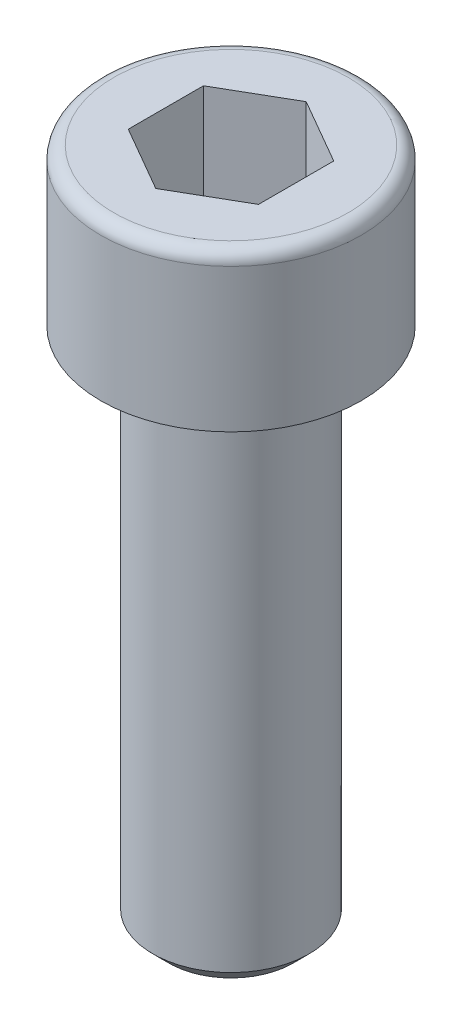
ISO-10303-21;
HEADER;
FILE_DESCRIPTION(('STEP AP214'),'2;1');
FILE_NAME('part.step','',(''),(''),'','','');
FILE_SCHEMA(('AUTOMOTIVE_DESIGN { 1 0 10303 214 1 1 1 1 }'));
ENDSEC;
DATA;
#1=APPLICATION_CONTEXT('core data for automotive mechanical design processes');
#2=APPLICATION_PROTOCOL_DEFINITION('international standard','automotive_design',2000,#1);
#3=PRODUCT_CONTEXT('',#1,'mechanical');
#4=PRODUCT('Part','Part','',(#3));
#5=PRODUCT_RELATED_PRODUCT_CATEGORY('part','',(#4));
#6=PRODUCT_DEFINITION_FORMATION('','',#4);
#7=PRODUCT_DEFINITION_CONTEXT('part definition',#1,'design');
#8=PRODUCT_DEFINITION('design','',#6,#7);
#9=PRODUCT_DEFINITION_SHAPE('','',#8);
#10=(LENGTH_UNIT() NAMED_UNIT(*) SI_UNIT(.MILLI.,.METRE.));
#11=(NAMED_UNIT(*) PLANE_ANGLE_UNIT() SI_UNIT($,.RADIAN.));
#12=(NAMED_UNIT(*) SI_UNIT($,.STERADIAN.) SOLID_ANGLE_UNIT());
#13=UNCERTAINTY_MEASURE_WITH_UNIT(LENGTH_MEASURE(1.E-05),#10,'distance_accuracy_value','');
#14=(GEOMETRIC_REPRESENTATION_CONTEXT(3) GLOBAL_UNCERTAINTY_ASSIGNED_CONTEXT((#13)) GLOBAL_UNIT_ASSIGNED_CONTEXT((#10,
#11,#12)) REPRESENTATION_CONTEXT('',''));
#15=CARTESIAN_POINT('',(0.,0.,0.));
#16=DIRECTION('',(0.,0.,1.));
#17=DIRECTION('',(1.,0.,0.));
#18=AXIS2_PLACEMENT_3D('',#15,#16,#17);
#19=CARTESIAN_POINT('',(0.,6.,0.));
#20=DIRECTION('',(0.,-1.,0.));
#21=DIRECTION('',(0.,0.,-1.));
#22=AXIS2_PLACEMENT_3D('',#19,#20,#21);
#23=PLANE('',#22);
#24=DIRECTION('',(0.866025403784448,0.,0.499999999999983));
#25=VECTOR('',#24,1.);
#26=CARTESIAN_POINT('',(-2.5,6.,1.4433756729741));
#27=LINE('',#26,#25);
#28=CARTESIAN_POINT('',(-2.5,6.,1.4433756729741));
#29=VERTEX_POINT('',#28);
#30=CARTESIAN_POINT('',(0.,6.,2.8867513459481));
#31=VERTEX_POINT('',#30);
#32=EDGE_CURVE('E73',#29,#31,#27,.T.);
#33=ORIENTED_EDGE('',*,*,#32,.F.);
#34=DIRECTION('',(0.,0.,1.));
#35=VECTOR('',#34,1.);
#36=CARTESIAN_POINT('',(-2.5,6.,-1.4433756729741));
#37=LINE('',#36,#35);
#38=CARTESIAN_POINT('',(-2.5,6.,-1.4433756729741));
#39=VERTEX_POINT('',#38);
#40=EDGE_CURVE('E86',#39,#29,#37,.T.);
#41=ORIENTED_EDGE('',*,*,#40,.F.);
#42=DIRECTION('',(-0.866025403784448,0.,0.499999999999983));
#43=VECTOR('',#42,1.);
#44=CARTESIAN_POINT('',(0.,6.,-2.8867513459481));
#45=LINE('',#44,#43);
#46=CARTESIAN_POINT('',(0.,6.,-2.8867513459481));
#47=VERTEX_POINT('',#46);
#48=EDGE_CURVE('E95',#47,#39,#45,.T.);
#49=ORIENTED_EDGE('',*,*,#48,.F.);
#50=DIRECTION('',(-0.866025403784448,0.,-0.499999999999983));
#51=VECTOR('',#50,1.);
#52=CARTESIAN_POINT('',(2.5,6.,-1.4433756729741));
#53=LINE('',#52,#51);
#54=CARTESIAN_POINT('',(2.5,6.,-1.4433756729741));
#55=VERTEX_POINT('',#54);
#56=EDGE_CURVE('E97',#55,#47,#53,.T.);
#57=ORIENTED_EDGE('',*,*,#56,.F.);
#58=DIRECTION('',(0.,0.,-1.));
#59=VECTOR('',#58,1.);
#60=CARTESIAN_POINT('',(2.5,6.,1.4433756729741));
#61=LINE('',#60,#59);
#62=CARTESIAN_POINT('',(2.5,6.,1.4433756729741));
#63=VERTEX_POINT('',#62);
#64=EDGE_CURVE('E108',#63,#55,#61,.T.);
#65=ORIENTED_EDGE('',*,*,#64,.F.);
#66=DIRECTION('',(0.866025403784448,0.,-0.499999999999983));
#67=VECTOR('',#66,1.);
#68=CARTESIAN_POINT('',(0.,6.,2.8867513459481));
#69=LINE('',#68,#67);
#70=EDGE_CURVE('E89',#31,#63,#69,.T.);
#71=ORIENTED_EDGE('',*,*,#70,.F.);
#72=EDGE_LOOP('',(#33,#41,#49,#57,#65,#71));
#73=FACE_BOUND('',#72,.T.);
#74=CARTESIAN_POINT('',(0.,6.,0.));
#75=DIRECTION('',(0.,-1.,0.));
#76=DIRECTION('',(0.,0.,-1.));
#77=AXIS2_PLACEMENT_3D('',#74,#75,#76);
#78=CIRCLE('',#77,4.49999997313664);
#79=CARTESIAN_POINT('',(0.,6.,-4.49999997313664));
#80=VERTEX_POINT('',#79);
#81=EDGE_CURVE('E116',#80,#80,#78,.T.);
#82=ORIENTED_EDGE('',*,*,#81,.F.);
#83=EDGE_LOOP('',(#82));
#84=FACE_BOUND('',#83,.T.);
#85=ADVANCED_FACE('F17',(#73,#84),#23,.F.);
#86=CARTESIAN_POINT('',(0.,5.50000000000009,0.));
#87=DIRECTION('',(0.,-1.,0.));
#88=DIRECTION('',(0.,0.,-1.));
#89=AXIS2_PLACEMENT_3D('',#86,#87,#88);
#90=TOROIDAL_SURFACE('',#89,4.50000000000009,0.499999999999911);
#91=ORIENTED_EDGE('',*,*,#81,.T.);
#92=EDGE_LOOP('',(#91));
#93=FACE_BOUND('',#92,.T.);
#94=CARTESIAN_POINT('',(0.,5.5,0.));
#95=DIRECTION('',(0.,-1.,0.));
#96=DIRECTION('',(0.,0.,-1.));
#97=AXIS2_PLACEMENT_3D('',#94,#95,#96);
#98=CIRCLE('',#97,5.);
#99=CARTESIAN_POINT('',(0.,5.5,-5.));
#100=VERTEX_POINT('',#99);
#101=EDGE_CURVE('E121',#100,#100,#98,.T.);
#102=ORIENTED_EDGE('',*,*,#101,.F.);
#103=EDGE_LOOP('',(#102));
#104=FACE_BOUND('',#103,.T.);
#105=ADVANCED_FACE('F190',(#93,#104),#90,.T.);
#106=CARTESIAN_POINT('',(0.,0.,0.));
#107=DIRECTION('',(0.,-1.,0.));
#108=DIRECTION('',(0.,0.,-1.));
#109=AXIS2_PLACEMENT_3D('',#106,#107,#108);
#110=CYLINDRICAL_SURFACE('',#109,5.);
#111=CARTESIAN_POINT('',(0.,0.,0.));
#112=DIRECTION('',(0.,-1.,0.));
#113=DIRECTION('',(0.,0.,-1.));
#114=AXIS2_PLACEMENT_3D('',#111,#112,#113);
#115=CIRCLE('',#114,5.);
#116=CARTESIAN_POINT('',(0.,0.,-5.));
#117=VERTEX_POINT('',#116);
#118=EDGE_CURVE('E124',#117,#117,#115,.T.);
#119=ORIENTED_EDGE('',*,*,#118,.F.);
#120=EDGE_LOOP('',(#119));
#121=FACE_BOUND('',#120,.T.);
#122=ORIENTED_EDGE('',*,*,#101,.T.);
#123=EDGE_LOOP('',(#122));
#124=FACE_BOUND('',#123,.T.);
#125=ADVANCED_FACE('F184',(#121,#124),#110,.T.);
#126=CARTESIAN_POINT('',(5.,0.,0.));
#127=DIRECTION('',(0.,1.,0.));
#128=DIRECTION('',(0.,0.,1.));
#129=AXIS2_PLACEMENT_3D('',#126,#127,#128);
#130=PLANE('',#129);
#131=CARTESIAN_POINT('',(0.,0.,0.));
#132=DIRECTION('',(0.,-1.,0.));
#133=DIRECTION('',(0.,0.,-1.));
#134=AXIS2_PLACEMENT_3D('',#131,#132,#133);
#135=CIRCLE('',#134,3.);
#136=CARTESIAN_POINT('',(0.,0.,-3.));
#137=VERTEX_POINT('',#136);
#138=EDGE_CURVE('E79',#137,#137,#135,.T.);
#139=ORIENTED_EDGE('',*,*,#138,.F.);
#140=EDGE_LOOP('',(#139));
#141=FACE_BOUND('',#140,.T.);
#142=ORIENTED_EDGE('',*,*,#118,.T.);
#143=EDGE_LOOP('',(#142));
#144=FACE_BOUND('',#143,.T.);
#145=ADVANCED_FACE('F181',(#141,#144),#130,.F.);
#146=CARTESIAN_POINT('',(-2.5,0.28,-1.4433756729741));
#147=DIRECTION('',(-1.,0.,0.));
#148=DIRECTION('',(0.,0.,1.));
#149=AXIS2_PLACEMENT_3D('',#146,#147,#148);
#150=PLANE('',#149);
#151=ORIENTED_EDGE('',*,*,#40,.T.);
#152=DIRECTION('',(0.,1.,0.));
#153=VECTOR('',#152,1.);
#154=CARTESIAN_POINT('',(-2.5,0.28,1.4433756729741));
#155=LINE('',#154,#153);
#156=CARTESIAN_POINT('',(-2.5,0.28,1.4433756729741));
#157=VERTEX_POINT('',#156);
#158=EDGE_CURVE('E69',#157,#29,#155,.T.);
#159=ORIENTED_EDGE('',*,*,#158,.F.);
#160=DIRECTION('',(0.,0.,1.));
#161=VECTOR('',#160,1.);
#162=CARTESIAN_POINT('',(-2.5,0.28,-1.4433756729741));
#163=LINE('',#162,#161);
#164=CARTESIAN_POINT('',(-2.5,0.28,-1.4433756729741));
#165=VERTEX_POINT('',#164);
#166=EDGE_CURVE('E78',#165,#157,#163,.T.);
#167=ORIENTED_EDGE('',*,*,#166,.F.);
#168=DIRECTION('',(0.,1.,0.));
#169=VECTOR('',#168,1.);
#170=CARTESIAN_POINT('',(-2.5,0.28,-1.4433756729741));
#171=LINE('',#170,#169);
#172=EDGE_CURVE('E94',#165,#39,#171,.T.);
#173=ORIENTED_EDGE('',*,*,#172,.T.);
#174=EDGE_LOOP('',(#151,#159,#167,#173));
#175=FACE_BOUND('',#174,.T.);
#176=ADVANCED_FACE('F92',(#175),#150,.F.);
#177=CARTESIAN_POINT('',(-2.5,0.28,1.4433756729741));
#178=DIRECTION('',(-0.499999999999983,0.,0.866025403784448));
#179=DIRECTION('',(0.866025403784448,0.,0.499999999999983));
#180=AXIS2_PLACEMENT_3D('',#177,#178,#179);
#181=PLANE('',#180);
#182=ORIENTED_EDGE('',*,*,#32,.T.);
#183=DIRECTION('',(0.,1.,0.));
#184=VECTOR('',#183,1.);
#185=CARTESIAN_POINT('',(0.,0.28,2.8867513459481));
#186=LINE('',#185,#184);
#187=CARTESIAN_POINT('',(0.,0.28,2.8867513459481));
#188=VERTEX_POINT('',#187);
#189=EDGE_CURVE('E135',#188,#31,#186,.T.);
#190=ORIENTED_EDGE('',*,*,#189,.F.);
#191=DIRECTION('',(0.866025403784448,0.,0.499999999999983));
#192=VECTOR('',#191,1.);
#193=CARTESIAN_POINT('',(-2.5,0.28,1.4433756729741));
#194=LINE('',#193,#192);
#195=EDGE_CURVE('E74',#157,#188,#194,.T.);
#196=ORIENTED_EDGE('',*,*,#195,.F.);
#197=ORIENTED_EDGE('',*,*,#158,.T.);
#198=EDGE_LOOP('',(#182,#190,#196,#197));
#199=FACE_BOUND('',#198,.T.);
#200=ADVANCED_FACE('F71',(#199),#181,.F.);
#201=CARTESIAN_POINT('',(0.,0.28,2.8867513459481));
#202=DIRECTION('',(0.499999999999983,0.,0.866025403784448));
#203=DIRECTION('',(0.866025403784448,0.,-0.499999999999983));
#204=AXIS2_PLACEMENT_3D('',#201,#202,#203);
#205=PLANE('',#204);
#206=ORIENTED_EDGE('',*,*,#70,.T.);
#207=DIRECTION('',(0.,1.,0.));
#208=VECTOR('',#207,1.);
#209=CARTESIAN_POINT('',(2.5,0.28,1.4433756729741));
#210=LINE('',#209,#208);
#211=CARTESIAN_POINT('',(2.5,0.28,1.4433756729741));
#212=VERTEX_POINT('',#211);
#213=EDGE_CURVE('E142',#212,#63,#210,.T.);
#214=ORIENTED_EDGE('',*,*,#213,.F.);
#215=DIRECTION('',(0.866025403784448,0.,-0.499999999999983));
#216=VECTOR('',#215,1.);
#217=CARTESIAN_POINT('',(0.,0.28,2.8867513459481));
#218=LINE('',#217,#216);
#219=EDGE_CURVE('E146',#188,#212,#218,.T.);
#220=ORIENTED_EDGE('',*,*,#219,.F.);
#221=ORIENTED_EDGE('',*,*,#189,.T.);
#222=EDGE_LOOP('',(#206,#214,#220,#221));
#223=FACE_BOUND('',#222,.T.);
#224=ADVANCED_FACE('F207',(#223),#205,.F.);
#225=CARTESIAN_POINT('',(2.5,0.28,1.4433756729741));
#226=DIRECTION('',(1.,0.,0.));
#227=DIRECTION('',(0.,0.,-1.));
#228=AXIS2_PLACEMENT_3D('',#225,#226,#227);
#229=PLANE('',#228);
#230=ORIENTED_EDGE('',*,*,#64,.T.);
#231=DIRECTION('',(0.,1.,0.));
#232=VECTOR('',#231,1.);
#233=CARTESIAN_POINT('',(2.5,0.28,-1.4433756729741));
#234=LINE('',#233,#232);
#235=CARTESIAN_POINT('',(2.5,0.28,-1.4433756729741));
#236=VERTEX_POINT('',#235);
#237=EDGE_CURVE('E150',#236,#55,#234,.T.);
#238=ORIENTED_EDGE('',*,*,#237,.F.);
#239=DIRECTION('',(0.,0.,-1.));
#240=VECTOR('',#239,1.);
#241=CARTESIAN_POINT('',(2.5,0.28,1.4433756729741));
#242=LINE('',#241,#240);
#243=EDGE_CURVE('E37',#212,#236,#242,.T.);
#244=ORIENTED_EDGE('',*,*,#243,.F.);
#245=ORIENTED_EDGE('',*,*,#213,.T.);
#246=EDGE_LOOP('',(#230,#238,#244,#245));
#247=FACE_BOUND('',#246,.T.);
#248=ADVANCED_FACE('F210',(#247),#229,.F.);
#249=CARTESIAN_POINT('',(2.5,0.28,-1.4433756729741));
#250=DIRECTION('',(0.499999999999983,0.,-0.866025403784448));
#251=DIRECTION('',(-0.866025403784448,0.,-0.499999999999983));
#252=AXIS2_PLACEMENT_3D('',#249,#250,#251);
#253=PLANE('',#252);
#254=ORIENTED_EDGE('',*,*,#56,.T.);
#255=DIRECTION('',(0.,1.,0.));
#256=VECTOR('',#255,1.);
#257=CARTESIAN_POINT('',(0.,0.28,-2.8867513459481));
#258=LINE('',#257,#256);
#259=CARTESIAN_POINT('',(0.,0.28,-2.8867513459481));
#260=VERTEX_POINT('',#259);
#261=EDGE_CURVE('E157',#260,#47,#258,.T.);
#262=ORIENTED_EDGE('',*,*,#261,.F.);
#263=DIRECTION('',(-0.866025403784448,0.,-0.499999999999983));
#264=VECTOR('',#263,1.);
#265=CARTESIAN_POINT('',(2.5,0.28,-1.4433756729741));
#266=LINE('',#265,#264);
#267=EDGE_CURVE('E32',#236,#260,#266,.T.);
#268=ORIENTED_EDGE('',*,*,#267,.F.);
#269=ORIENTED_EDGE('',*,*,#237,.T.);
#270=EDGE_LOOP('',(#254,#262,#268,#269));
#271=FACE_BOUND('',#270,.T.);
#272=ADVANCED_FACE('F214',(#271),#253,.F.);
#273=CARTESIAN_POINT('',(0.,0.28,-2.8867513459481));
#274=DIRECTION('',(-0.499999999999983,0.,-0.866025403784448));
#275=DIRECTION('',(-0.866025403784448,0.,0.499999999999983));
#276=AXIS2_PLACEMENT_3D('',#273,#274,#275);
#277=PLANE('',#276);
#278=ORIENTED_EDGE('',*,*,#48,.T.);
#279=ORIENTED_EDGE('',*,*,#172,.F.);
#280=DIRECTION('',(-0.866025403784448,0.,0.499999999999983));
#281=VECTOR('',#280,1.);
#282=CARTESIAN_POINT('',(0.,0.28,-2.8867513459481));
#283=LINE('',#282,#281);
#284=EDGE_CURVE('E164',#260,#165,#283,.T.);
#285=ORIENTED_EDGE('',*,*,#284,.F.);
#286=ORIENTED_EDGE('',*,*,#261,.T.);
#287=EDGE_LOOP('',(#278,#279,#285,#286));
#288=FACE_BOUND('',#287,.T.);
#289=ADVANCED_FACE('F218',(#288),#277,.F.);
#290=CARTESIAN_POINT('',(0.,0.28,0.));
#291=DIRECTION('',(0.,1.,0.));
#292=DIRECTION('',(0.,0.,1.));
#293=AXIS2_PLACEMENT_3D('',#290,#291,#292);
#294=PLANE('',#293);
#295=ORIENTED_EDGE('',*,*,#166,.T.);
#296=ORIENTED_EDGE('',*,*,#195,.T.);
#297=ORIENTED_EDGE('',*,*,#219,.T.);
#298=ORIENTED_EDGE('',*,*,#243,.T.);
#299=ORIENTED_EDGE('',*,*,#267,.T.);
#300=ORIENTED_EDGE('',*,*,#284,.T.);
#301=EDGE_LOOP('',(#295,#296,#297,#298,#299,#300));
#302=FACE_BOUND('',#301,.T.);
#303=ADVANCED_FACE('F177',(#302),#294,.T.);
#304=CARTESIAN_POINT('',(0.,-20.,0.));
#305=DIRECTION('',(0.,-1.,0.));
#306=DIRECTION('',(0.,0.,-1.));
#307=AXIS2_PLACEMENT_3D('',#304,#305,#306);
#308=CYLINDRICAL_SURFACE('',#307,3.);
#309=CARTESIAN_POINT('',(0.,-19.3865,0.));
#310=DIRECTION('',(0.,-1.,0.));
#311=DIRECTION('',(0.,0.,-1.));
#312=AXIS2_PLACEMENT_3D('',#309,#310,#311);
#313=CIRCLE('',#312,3.);
#314=CARTESIAN_POINT('',(0.,-19.3865,-3.));
#315=VERTEX_POINT('',#314);
#316=EDGE_CURVE('E25',#315,#315,#313,.T.);
#317=ORIENTED_EDGE('',*,*,#316,.F.);
#318=EDGE_LOOP('',(#317));
#319=FACE_BOUND('',#318,.T.);
#320=ORIENTED_EDGE('',*,*,#138,.T.);
#321=EDGE_LOOP('',(#320));
#322=FACE_BOUND('',#321,.T.);
#323=ADVANCED_FACE('F174',(#319,#322),#308,.T.);
#324=CARTESIAN_POINT('',(0.,-19.3865,0.));
#325=DIRECTION('',(0.,1.,0.));
#326=DIRECTION('',(0.,0.,1.));
#327=AXIS2_PLACEMENT_3D('',#324,#325,#326);
#328=CONICAL_SURFACE('',#327,3.,0.785398163397449);
#329=CARTESIAN_POINT('',(0.,-20.,0.));
#330=DIRECTION('',(0.,-1.,0.));
#331=DIRECTION('',(0.,0.,-1.));
#332=AXIS2_PLACEMENT_3D('',#329,#330,#331);
#333=CIRCLE('',#332,2.3865);
#334=CARTESIAN_POINT('',(0.,-20.,-2.3865));
#335=VERTEX_POINT('',#334);
#336=EDGE_CURVE('E11',#335,#335,#333,.T.);
#337=ORIENTED_EDGE('',*,*,#336,.F.);
#338=EDGE_LOOP('',(#337));
#339=FACE_BOUND('',#338,.T.);
#340=ORIENTED_EDGE('',*,*,#316,.T.);
#341=EDGE_LOOP('',(#340));
#342=FACE_BOUND('',#341,.T.);
#343=ADVANCED_FACE('F172',(#339,#342),#328,.T.);
#344=CARTESIAN_POINT('',(2.3865,-20.,0.));
#345=DIRECTION('',(0.,1.,0.));
#346=DIRECTION('',(0.,0.,1.));
#347=AXIS2_PLACEMENT_3D('',#344,#345,#346);
#348=PLANE('',#347);
#349=ORIENTED_EDGE('',*,*,#336,.T.);
#350=EDGE_LOOP('',(#349));
#351=FACE_BOUND('',#350,.T.);
#352=ADVANCED_FACE('F19',(#351),#348,.F.);
#353=CLOSED_SHELL('',(#85,#105,#125,#145,#176,#200,#224,#248,#272,#289,#303,#323,#343,#352));
#354=MANIFOLD_SOLID_BREP('B1',#353);
#355=ADVANCED_BREP_SHAPE_REPRESENTATION('',(#18,#354),#14);
#356=SHAPE_DEFINITION_REPRESENTATION(#9,#355);
ENDSEC;
END-ISO-10303-21;
